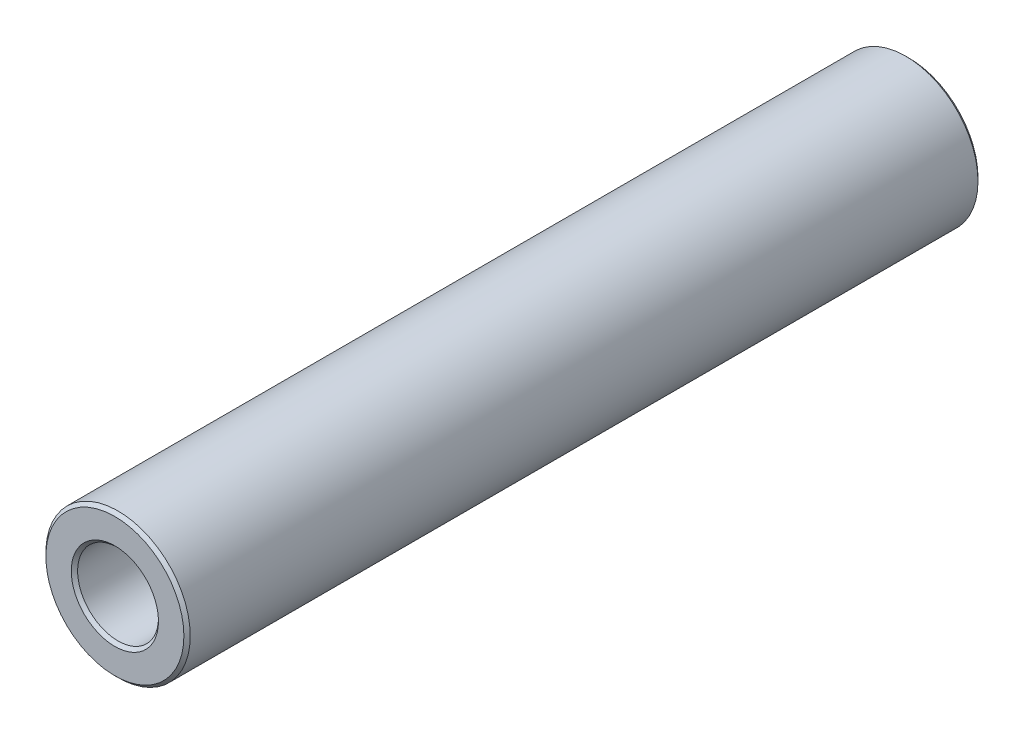
ISO-10303-21;
HEADER;
FILE_DESCRIPTION(('STEP AP214'),'2;1');
FILE_NAME('part.step','',(''),(''),'','','');
FILE_SCHEMA(('AUTOMOTIVE_DESIGN { 1 0 10303 214 1 1 1 1 }'));
ENDSEC;
DATA;
#1=APPLICATION_CONTEXT('core data for automotive mechanical design processes');
#2=APPLICATION_PROTOCOL_DEFINITION('international standard','automotive_design',2000,#1);
#3=PRODUCT_CONTEXT('',#1,'mechanical');
#4=PRODUCT('Part','Part','',(#3));
#5=PRODUCT_RELATED_PRODUCT_CATEGORY('part','',(#4));
#6=PRODUCT_DEFINITION_FORMATION('','',#4);
#7=PRODUCT_DEFINITION_CONTEXT('part definition',#1,'design');
#8=PRODUCT_DEFINITION('design','',#6,#7);
#9=PRODUCT_DEFINITION_SHAPE('','',#8);
#10=(LENGTH_UNIT() NAMED_UNIT(*) SI_UNIT(.MILLI.,.METRE.));
#11=(NAMED_UNIT(*) PLANE_ANGLE_UNIT() SI_UNIT($,.RADIAN.));
#12=(NAMED_UNIT(*) SI_UNIT($,.STERADIAN.) SOLID_ANGLE_UNIT());
#13=UNCERTAINTY_MEASURE_WITH_UNIT(LENGTH_MEASURE(1.E-05),#10,'distance_accuracy_value','');
#14=(GEOMETRIC_REPRESENTATION_CONTEXT(3) GLOBAL_UNCERTAINTY_ASSIGNED_CONTEXT((#13)) GLOBAL_UNIT_ASSIGNED_CONTEXT((#10,
#11,#12)) REPRESENTATION_CONTEXT('',''));
#15=CARTESIAN_POINT('',(0.,0.,0.));
#16=DIRECTION('',(0.,0.,1.));
#17=DIRECTION('',(1.,0.,0.));
#18=AXIS2_PLACEMENT_3D('',#15,#16,#17);
#19=CARTESIAN_POINT('',(0.,0.,-17.4625));
#20=DIRECTION('',(0.,0.,1.));
#21=DIRECTION('',(1.,0.,0.));
#22=AXIS2_PLACEMENT_3D('',#19,#20,#21);
#23=CYLINDRICAL_SURFACE('',#22,3.175);
#24=CARTESIAN_POINT('',(0.,0.,17.3228));
#25=DIRECTION('',(0.,0.,1.));
#26=DIRECTION('',(1.,0.,0.));
#27=AXIS2_PLACEMENT_3D('',#24,#25,#26);
#28=CIRCLE('',#27,3.175);
#29=CARTESIAN_POINT('',(3.175,0.,17.3228));
#30=VERTEX_POINT('',#29);
#31=EDGE_CURVE('E65',#30,#30,#28,.F.);
#32=ORIENTED_EDGE('',*,*,#31,.T.);
#33=EDGE_LOOP('',(#32));
#34=FACE_BOUND('',#33,.T.);
#35=CARTESIAN_POINT('',(0.,0.,-17.3228));
#36=DIRECTION('',(0.,0.,1.));
#37=DIRECTION('',(1.,0.,0.));
#38=AXIS2_PLACEMENT_3D('',#35,#36,#37);
#39=CIRCLE('',#38,3.175);
#40=CARTESIAN_POINT('',(3.175,0.,-17.3228));
#41=VERTEX_POINT('',#40);
#42=EDGE_CURVE('E68',#41,#41,#39,.T.);
#43=ORIENTED_EDGE('',*,*,#42,.T.);
#44=EDGE_LOOP('',(#43));
#45=FACE_BOUND('',#44,.T.);
#46=ADVANCED_FACE('F39',(#34,#45),#23,.T.);
#47=CARTESIAN_POINT('',(0.,0.,-17.4625));
#48=DIRECTION('',(0.,0.,1.));
#49=DIRECTION('',(1.,0.,0.));
#50=AXIS2_PLACEMENT_3D('',#47,#48,#49);
#51=PLANE('',#50);
#52=CARTESIAN_POINT('',(0.,0.,-17.4625));
#53=DIRECTION('',(0.,0.,1.));
#54=DIRECTION('',(1.,0.,0.));
#55=AXIS2_PLACEMENT_3D('',#52,#53,#54);
#56=CIRCLE('',#55,3.03530000000001);
#57=CARTESIAN_POINT('',(3.03530000000001,0.,-17.4625));
#58=VERTEX_POINT('',#57);
#59=EDGE_CURVE('E54',#58,#58,#56,.F.);
#60=ORIENTED_EDGE('',*,*,#59,.T.);
#61=EDGE_LOOP('',(#60));
#62=FACE_BOUND('',#61,.T.);
#63=CARTESIAN_POINT('',(0.,0.,-17.4625));
#64=DIRECTION('',(0.,0.,1.));
#65=DIRECTION('',(1.,0.,0.));
#66=AXIS2_PLACEMENT_3D('',#63,#64,#65);
#67=CIRCLE('',#66,1.9177);
#68=CARTESIAN_POINT('',(1.9177,0.,-17.4625));
#69=VERTEX_POINT('',#68);
#70=EDGE_CURVE('E60',#69,#69,#67,.T.);
#71=ORIENTED_EDGE('',*,*,#70,.T.);
#72=EDGE_LOOP('',(#71));
#73=FACE_BOUND('',#72,.T.);
#74=ADVANCED_FACE('F95',(#62,#73),#51,.F.);
#75=CARTESIAN_POINT('',(0.,0.,-17.4625));
#76=DIRECTION('',(0.,0.,1.));
#77=DIRECTION('',(1.,0.,0.));
#78=AXIS2_PLACEMENT_3D('',#75,#76,#77);
#79=CYLINDRICAL_SURFACE('',#78,1.778);
#80=CARTESIAN_POINT('',(0.,0.,17.3228));
#81=DIRECTION('',(0.,0.,1.));
#82=DIRECTION('',(1.,0.,0.));
#83=AXIS2_PLACEMENT_3D('',#80,#81,#82);
#84=CIRCLE('',#83,1.778);
#85=CARTESIAN_POINT('',(1.778,0.,17.3228));
#86=VERTEX_POINT('',#85);
#87=EDGE_CURVE('E10',#86,#86,#84,.T.);
#88=CARTESIAN_POINT('',(0.,0.,-17.3228));
#89=DIRECTION('',(0.,0.,1.));
#90=DIRECTION('',(1.,0.,0.));
#91=AXIS2_PLACEMENT_3D('',#88,#89,#90);
#92=CIRCLE('',#91,1.778);
#93=CARTESIAN_POINT('',(1.778,0.,-17.3228));
#94=VERTEX_POINT('',#93);
#95=EDGE_CURVE('E47',#94,#94,#92,.F.);
#96=CARTESIAN_POINT('',(1.778,0.,17.3228));
#97=CARTESIAN_POINT('',(1.778,0.,16.9619083333333));
#98=CARTESIAN_POINT('',(1.778,0.,16.6010166666667));
#99=CARTESIAN_POINT('',(1.778,0.,15.8792333333333));
#100=CARTESIAN_POINT('',(1.778,0.,15.5183416666667));
#101=CARTESIAN_POINT('',(1.778,0.,14.7965583333333));
#102=CARTESIAN_POINT('',(1.778,0.,14.4356666666667));
#103=CARTESIAN_POINT('',(1.778,0.,13.7138833333333));
#104=CARTESIAN_POINT('',(1.778,0.,13.3529916666667));
#105=CARTESIAN_POINT('',(1.778,0.,12.6312083333333));
#106=CARTESIAN_POINT('',(1.778,0.,12.2703166666667));
#107=CARTESIAN_POINT('',(1.778,0.,11.5485333333333));
#108=CARTESIAN_POINT('',(1.778,0.,11.1876416666667));
#109=CARTESIAN_POINT('',(1.778,0.,10.4658583333333));
#110=CARTESIAN_POINT('',(1.778,0.,10.1049666666667));
#111=CARTESIAN_POINT('',(1.778,0.,9.38318333333333));
#112=CARTESIAN_POINT('',(1.778,0.,9.02229166666666));
#113=CARTESIAN_POINT('',(1.778,0.,8.30050833333333));
#114=CARTESIAN_POINT('',(1.778,0.,7.93961666666666));
#115=CARTESIAN_POINT('',(1.778,0.,7.21783333333333));
#116=CARTESIAN_POINT('',(1.778,0.,6.85694166666666));
#117=CARTESIAN_POINT('',(1.778,0.,6.13515833333333));
#118=CARTESIAN_POINT('',(1.778,0.,5.77426666666666));
#119=CARTESIAN_POINT('',(1.778,0.,5.05248333333333));
#120=CARTESIAN_POINT('',(1.778,0.,4.69159166666666));
#121=CARTESIAN_POINT('',(1.778,0.,3.96980833333333));
#122=CARTESIAN_POINT('',(1.778,0.,3.60891666666666));
#123=CARTESIAN_POINT('',(1.778,0.,2.88713333333333));
#124=CARTESIAN_POINT('',(1.778,0.,2.52624166666666));
#125=CARTESIAN_POINT('',(1.778,0.,1.80445833333333));
#126=CARTESIAN_POINT('',(1.778,0.,1.44356666666666));
#127=CARTESIAN_POINT('',(1.778,0.,0.721783333333329));
#128=CARTESIAN_POINT('',(1.778,0.,0.360891666666663));
#129=CARTESIAN_POINT('',(1.778,0.,-0.360891666666669));
#130=CARTESIAN_POINT('',(1.778,0.,-0.721783333333336));
#131=CARTESIAN_POINT('',(1.778,0.,-1.44356666666667));
#132=CARTESIAN_POINT('',(1.778,0.,-1.80445833333334));
#133=CARTESIAN_POINT('',(1.778,0.,-2.52624166666667));
#134=CARTESIAN_POINT('',(1.778,0.,-2.88713333333334));
#135=CARTESIAN_POINT('',(1.778,0.,-3.60891666666667));
#136=CARTESIAN_POINT('',(1.778,0.,-3.96980833333334));
#137=CARTESIAN_POINT('',(1.778,0.,-4.69159166666667));
#138=CARTESIAN_POINT('',(1.778,0.,-5.05248333333334));
#139=CARTESIAN_POINT('',(1.778,0.,-5.77426666666667));
#140=CARTESIAN_POINT('',(1.778,0.,-6.13515833333334));
#141=CARTESIAN_POINT('',(1.778,0.,-6.85694166666667));
#142=CARTESIAN_POINT('',(1.778,0.,-7.21783333333334));
#143=CARTESIAN_POINT('',(1.778,0.,-7.93961666666667));
#144=CARTESIAN_POINT('',(1.778,0.,-8.30050833333333));
#145=CARTESIAN_POINT('',(1.778,0.,-9.02229166666667));
#146=CARTESIAN_POINT('',(1.778,0.,-9.38318333333333));
#147=CARTESIAN_POINT('',(1.778,0.,-10.1049666666667));
#148=CARTESIAN_POINT('',(1.778,0.,-10.4658583333333));
#149=CARTESIAN_POINT('',(1.778,0.,-11.1876416666667));
#150=CARTESIAN_POINT('',(1.778,0.,-11.5485333333333));
#151=CARTESIAN_POINT('',(1.778,0.,-12.2703166666667));
#152=CARTESIAN_POINT('',(1.778,0.,-12.6312083333333));
#153=CARTESIAN_POINT('',(1.778,0.,-13.3529916666667));
#154=CARTESIAN_POINT('',(1.778,0.,-13.7138833333333));
#155=CARTESIAN_POINT('',(1.778,0.,-14.4356666666667));
#156=CARTESIAN_POINT('',(1.778,0.,-14.7965583333333));
#157=CARTESIAN_POINT('',(1.778,0.,-15.5183416666667));
#158=CARTESIAN_POINT('',(1.778,0.,-15.8792333333333));
#159=CARTESIAN_POINT('',(1.778,0.,-16.6010166666667));
#160=CARTESIAN_POINT('',(1.778,0.,-16.9619083333333));
#161=CARTESIAN_POINT('',(1.778,0.,-17.3228));
#162=B_SPLINE_CURVE_WITH_KNOTS('',3,(#96,#97,#98,#99,#100,#101,#102,#103,#104,#105,#106,#107,
#108,#109,#110,#111,#112,#113,#114,#115,#116,#117,#118,#119,#120,#121,#122,#123,#124,#125,#126,
#127,#128,#129,#130,#131,#132,#133,#134,#135,#136,#137,#138,#139,#140,#141,#142,#143,#144,#145,
#146,#147,#148,#149,#150,#151,#152,#153,#154,#155,#156,#157,#158,#159,#160,#161),.UNSPECIFIED.,
.F.,.F.,(4,2,2,2,2,2,2,2,2,2,2,2,2,2,2,2,2,2,2,2,2,2,2,2,2,2,2,2,2,2,2,2,4),(0.,1.082675,
2.16535,3.248025,4.3307,5.413375,6.49605,7.578725,8.6614,9.744075,10.82675,11.909425,12.9921,
14.074775,15.15745,16.240125,17.3228,18.405475,19.48815,20.570825,21.6535,22.736175,23.81885,
24.901525,25.9842,27.066875,28.14955,29.232225,30.3149,31.397575,32.48025,33.562925,34.6456),.UNSPECIFIED.);
#163=EDGE_CURVE('BSEAM101',#86,#94,#162,.T.);
#164=ORIENTED_EDGE('',*,*,#87,.T.);
#165=ORIENTED_EDGE('',*,*,#95,.T.);
#166=ORIENTED_EDGE('',*,*,#163,.T.);
#167=ORIENTED_EDGE('',*,*,#163,.F.);
#168=EDGE_LOOP('',(#164,#166,#165,#167));
#169=FACE_BOUND('',#168,.T.);
#170=ADVANCED_FACE('F101',(#169),#79,.F.);
#171=CARTESIAN_POINT('',(0.,0.,17.4625));
#172=DIRECTION('',(0.,0.,1.));
#173=DIRECTION('',(1.,0.,0.));
#174=AXIS2_PLACEMENT_3D('',#171,#172,#173);
#175=PLANE('',#174);
#176=CARTESIAN_POINT('',(0.,0.,17.4625));
#177=DIRECTION('',(0.,0.,1.));
#178=DIRECTION('',(1.,0.,0.));
#179=AXIS2_PLACEMENT_3D('',#176,#177,#178);
#180=CIRCLE('',#179,3.0353);
#181=CARTESIAN_POINT('',(3.0353,0.,17.4625));
#182=VERTEX_POINT('',#181);
#183=EDGE_CURVE('E72',#182,#182,#180,.T.);
#184=ORIENTED_EDGE('',*,*,#183,.T.);
#185=EDGE_LOOP('',(#184));
#186=FACE_BOUND('',#185,.T.);
#187=CARTESIAN_POINT('',(0.,0.,17.4625));
#188=DIRECTION('',(0.,0.,1.));
#189=DIRECTION('',(1.,0.,0.));
#190=AXIS2_PLACEMENT_3D('',#187,#188,#189);
#191=CIRCLE('',#190,1.9177);
#192=CARTESIAN_POINT('',(1.9177,0.,17.4625));
#193=VERTEX_POINT('',#192);
#194=EDGE_CURVE('E75',#193,#193,#191,.F.);
#195=ORIENTED_EDGE('',*,*,#194,.T.);
#196=EDGE_LOOP('',(#195));
#197=FACE_BOUND('',#196,.T.);
#198=ADVANCED_FACE('F80',(#186,#197),#175,.T.);
#199=CARTESIAN_POINT('',(0.,0.,17.4625));
#200=DIRECTION('',(0.,0.,-1.));
#201=DIRECTION('',(-1.,0.,0.));
#202=AXIS2_PLACEMENT_3D('',#199,#200,#201);
#203=CONICAL_SURFACE('',#202,3.0353,0.785398163397458);
#204=ORIENTED_EDGE('',*,*,#31,.F.);
#205=EDGE_LOOP('',(#204));
#206=FACE_BOUND('',#205,.T.);
#207=ORIENTED_EDGE('',*,*,#183,.F.);
#208=EDGE_LOOP('',(#207));
#209=FACE_BOUND('',#208,.T.);
#210=ADVANCED_FACE('F91',(#206,#209),#203,.T.);
#211=CARTESIAN_POINT('',(0.,0.,-17.3228));
#212=DIRECTION('',(0.,0.,1.));
#213=DIRECTION('',(1.,0.,0.));
#214=AXIS2_PLACEMENT_3D('',#211,#212,#213);
#215=CONICAL_SURFACE('',#214,3.175,0.785398163397445);
#216=ORIENTED_EDGE('',*,*,#59,.F.);
#217=EDGE_LOOP('',(#216));
#218=FACE_BOUND('',#217,.T.);
#219=ORIENTED_EDGE('',*,*,#42,.F.);
#220=EDGE_LOOP('',(#219));
#221=FACE_BOUND('',#220,.T.);
#222=ADVANCED_FACE('F85',(#218,#221),#215,.T.);
#223=CARTESIAN_POINT('',(0.,0.,17.3228));
#224=DIRECTION('',(0.,0.,1.));
#225=DIRECTION('',(1.,0.,0.));
#226=AXIS2_PLACEMENT_3D('',#223,#224,#225);
#227=CONICAL_SURFACE('',#226,1.778,0.785398163397454);
#228=CARTESIAN_POINT('',(1.9177,0.,17.4625));
#229=CARTESIAN_POINT('',(1.91624479166667,0.,17.4610447916667));
#230=CARTESIAN_POINT('',(1.91478958333333,0.,17.4595895833333));
#231=CARTESIAN_POINT('',(1.91187916666667,0.,17.4566791666667));
#232=CARTESIAN_POINT('',(1.91042395833333,0.,17.4552239583333));
#233=CARTESIAN_POINT('',(1.90751354166667,0.,17.4523135416667));
#234=CARTESIAN_POINT('',(1.90605833333333,0.,17.4508583333333));
#235=CARTESIAN_POINT('',(1.90314791666667,0.,17.4479479166667));
#236=CARTESIAN_POINT('',(1.90169270833333,0.,17.4464927083333));
#237=CARTESIAN_POINT('',(1.89878229166667,0.,17.4435822916667));
#238=CARTESIAN_POINT('',(1.89732708333333,0.,17.4421270833333));
#239=CARTESIAN_POINT('',(1.89441666666667,0.,17.4392166666667));
#240=CARTESIAN_POINT('',(1.89296145833333,0.,17.4377614583333));
#241=CARTESIAN_POINT('',(1.89005104166667,0.,17.4348510416667));
#242=CARTESIAN_POINT('',(1.88859583333333,0.,17.4333958333333));
#243=CARTESIAN_POINT('',(1.88568541666667,0.,17.4304854166667));
#244=CARTESIAN_POINT('',(1.88423020833333,0.,17.4290302083333));
#245=CARTESIAN_POINT('',(1.88131979166667,0.,17.4261197916667));
#246=CARTESIAN_POINT('',(1.87986458333333,0.,17.4246645833333));
#247=CARTESIAN_POINT('',(1.87695416666667,0.,17.4217541666667));
#248=CARTESIAN_POINT('',(1.87549895833333,0.,17.4202989583333));
#249=CARTESIAN_POINT('',(1.87258854166667,0.,17.4173885416667));
#250=CARTESIAN_POINT('',(1.87113333333333,0.,17.4159333333333));
#251=CARTESIAN_POINT('',(1.86822291666667,0.,17.4130229166667));
#252=CARTESIAN_POINT('',(1.86676770833333,0.,17.4115677083333));
#253=CARTESIAN_POINT('',(1.86385729166667,0.,17.4086572916667));
#254=CARTESIAN_POINT('',(1.86240208333333,0.,17.4072020833333));
#255=CARTESIAN_POINT('',(1.85949166666667,0.,17.4042916666667));
#256=CARTESIAN_POINT('',(1.85803645833333,0.,17.4028364583333));
#257=CARTESIAN_POINT('',(1.85512604166667,0.,17.3999260416667));
#258=CARTESIAN_POINT('',(1.85367083333333,0.,17.3984708333333));
#259=CARTESIAN_POINT('',(1.85076041666667,0.,17.3955604166667));
#260=CARTESIAN_POINT('',(1.84930520833333,0.,17.3941052083333));
#261=CARTESIAN_POINT('',(1.84639479166667,0.,17.3911947916667));
#262=CARTESIAN_POINT('',(1.84493958333333,0.,17.3897395833333));
#263=CARTESIAN_POINT('',(1.84202916666667,0.,17.3868291666667));
#264=CARTESIAN_POINT('',(1.84057395833333,0.,17.3853739583333));
#265=CARTESIAN_POINT('',(1.83766354166667,0.,17.3824635416667));
#266=CARTESIAN_POINT('',(1.83620833333333,0.,17.3810083333333));
#267=CARTESIAN_POINT('',(1.83329791666667,0.,17.3780979166667));
#268=CARTESIAN_POINT('',(1.83184270833333,0.,17.3766427083333));
#269=CARTESIAN_POINT('',(1.82893229166667,0.,17.3737322916667));
#270=CARTESIAN_POINT('',(1.82747708333333,0.,17.3722770833333));
#271=CARTESIAN_POINT('',(1.82456666666667,0.,17.3693666666667));
#272=CARTESIAN_POINT('',(1.82311145833333,0.,17.3679114583333));
#273=CARTESIAN_POINT('',(1.82020104166667,0.,17.3650010416667));
#274=CARTESIAN_POINT('',(1.81874583333333,0.,17.3635458333333));
#275=CARTESIAN_POINT('',(1.81583541666667,0.,17.3606354166667));
#276=CARTESIAN_POINT('',(1.81438020833333,0.,17.3591802083333));
#277=CARTESIAN_POINT('',(1.81146979166667,0.,17.3562697916667));
#278=CARTESIAN_POINT('',(1.81001458333333,0.,17.3548145833333));
#279=CARTESIAN_POINT('',(1.80710416666667,0.,17.3519041666667));
#280=CARTESIAN_POINT('',(1.80564895833333,0.,17.3504489583333));
#281=CARTESIAN_POINT('',(1.80273854166667,0.,17.3475385416667));
#282=CARTESIAN_POINT('',(1.80128333333333,0.,17.3460833333333));
#283=CARTESIAN_POINT('',(1.79837291666667,0.,17.3431729166667));
#284=CARTESIAN_POINT('',(1.79691770833333,0.,17.3417177083333));
#285=CARTESIAN_POINT('',(1.79400729166666,0.,17.3388072916667));
#286=CARTESIAN_POINT('',(1.79255208333333,0.,17.3373520833333));
#287=CARTESIAN_POINT('',(1.78964166666667,0.,17.3344416666667));
#288=CARTESIAN_POINT('',(1.78818645833333,0.,17.3329864583333));
#289=CARTESIAN_POINT('',(1.78527604166666,0.,17.3300760416667));
#290=CARTESIAN_POINT('',(1.78382083333333,0.,17.3286208333333));
#291=CARTESIAN_POINT('',(1.78091041666667,0.,17.3257104166667));
#292=CARTESIAN_POINT('',(1.77945520833333,0.,17.3242552083333));
#293=CARTESIAN_POINT('',(1.778,0.,17.3228));
#294=B_SPLINE_CURVE_WITH_KNOTS('',3,(#228,#229,#230,#231,#232,#233,#234,#235,#236,#237,#238,
#239,#240,#241,#242,#243,#244,#245,#246,#247,#248,#249,#250,#251,#252,#253,#254,#255,#256,#257,
#258,#259,#260,#261,#262,#263,#264,#265,#266,#267,#268,#269,#270,#271,#272,#273,#274,#275,#276,
#277,#278,#279,#280,#281,#282,#283,#284,#285,#286,#287,#288,#289,#290,#291,#292,#293),
.UNSPECIFIED.,.F.,.F.,(4,2,2,2,2,2,2,2,2,2,2,2,2,2,2,2,2,2,2,2,2,2,2,2,2,2,2,2,2,2,2,2,4),(0.,
0.00617392608323426,0.0123478521664685,0.0185217782497029,0.0246957043329396,0.0308696304161739,
0.0370435564994082,0.043217482582645,0.0493914086658793,0.0555653347491135,0.0617392608323502,
0.0679131869155845,0.0740871129988189,0.0802610390820556,0.0864349651652899,0.0926088912485241,
0.0987828173317608,0.104956743414995,0.111130669498229,0.117304595581464,0.1234785216647,
0.129652447747935,0.135826373831169,0.142000299914406,0.14817422599764,0.154348152080874,
0.160522078164111,0.166696004247345,0.17286993033058,0.179043856413816,0.185217782497051,
0.191391708580285,0.197565634663519),.UNSPECIFIED.);
#295=EDGE_CURVE('BSEAM82',#193,#86,#294,.T.);
#296=ORIENTED_EDGE('',*,*,#194,.F.);
#297=ORIENTED_EDGE('',*,*,#87,.F.);
#298=ORIENTED_EDGE('',*,*,#295,.T.);
#299=ORIENTED_EDGE('',*,*,#295,.F.);
#300=EDGE_LOOP('',(#296,#298,#297,#299));
#301=FACE_BOUND('',#300,.T.);
#302=ADVANCED_FACE('F82',(#301),#227,.F.);
#303=CARTESIAN_POINT('',(0.,0.,-17.4625));
#304=DIRECTION('',(0.,0.,-1.));
#305=DIRECTION('',(-1.,0.,0.));
#306=AXIS2_PLACEMENT_3D('',#303,#304,#305);
#307=CONICAL_SURFACE('',#306,1.9177,0.785398163397442);
#308=ORIENTED_EDGE('',*,*,#95,.F.);
#309=EDGE_LOOP('',(#308));
#310=FACE_BOUND('',#309,.T.);
#311=ORIENTED_EDGE('',*,*,#70,.F.);
#312=EDGE_LOOP('',(#311));
#313=FACE_BOUND('',#312,.T.);
#314=ADVANCED_FACE('F41',(#310,#313),#307,.F.);
#315=CLOSED_SHELL('',(#46,#74,#170,#198,#210,#222,#302,#314));
#316=MANIFOLD_SOLID_BREP('B2',#315);
#317=ADVANCED_BREP_SHAPE_REPRESENTATION('',(#18,#316),#14);
#318=SHAPE_DEFINITION_REPRESENTATION(#9,#317);
ENDSEC;
END-ISO-10303-21;
